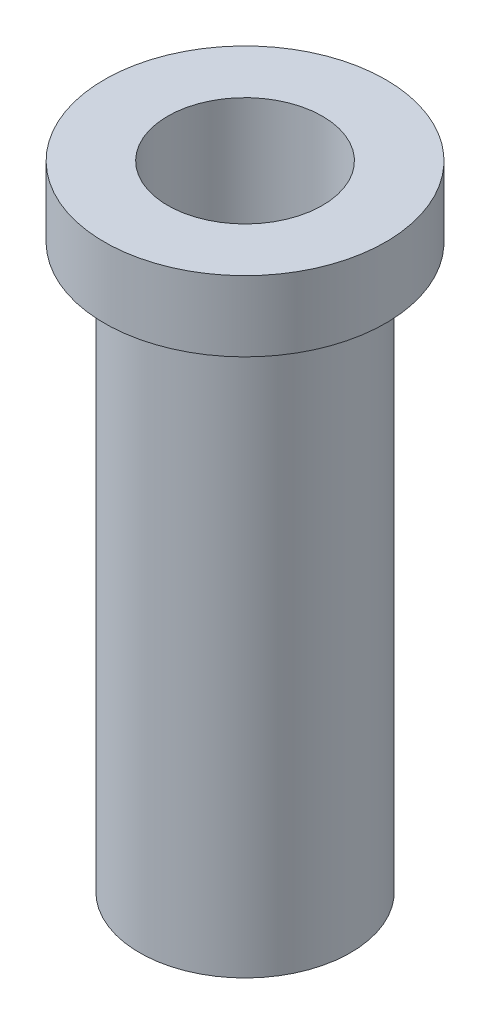
ISO-10303-21;
HEADER;
FILE_DESCRIPTION(('STEP AP214'),'2;1');
FILE_NAME('part.step','',(''),(''),'','','');
FILE_SCHEMA(('AUTOMOTIVE_DESIGN { 1 0 10303 214 1 1 1 1 }'));
ENDSEC;
DATA;
#1=APPLICATION_CONTEXT('core data for automotive mechanical design processes');
#2=APPLICATION_PROTOCOL_DEFINITION('international standard','automotive_design',2000,#1);
#3=PRODUCT_CONTEXT('',#1,'mechanical');
#4=PRODUCT('Part','Part','',(#3));
#5=PRODUCT_RELATED_PRODUCT_CATEGORY('part','',(#4));
#6=PRODUCT_DEFINITION_FORMATION('','',#4);
#7=PRODUCT_DEFINITION_CONTEXT('part definition',#1,'design');
#8=PRODUCT_DEFINITION('design','',#6,#7);
#9=PRODUCT_DEFINITION_SHAPE('','',#8);
#10=(LENGTH_UNIT() NAMED_UNIT(*) SI_UNIT(.MILLI.,.METRE.));
#11=(NAMED_UNIT(*) PLANE_ANGLE_UNIT() SI_UNIT($,.RADIAN.));
#12=(NAMED_UNIT(*) SI_UNIT($,.STERADIAN.) SOLID_ANGLE_UNIT());
#13=UNCERTAINTY_MEASURE_WITH_UNIT(LENGTH_MEASURE(1.E-05),#10,'distance_accuracy_value','');
#14=(GEOMETRIC_REPRESENTATION_CONTEXT(3) GLOBAL_UNCERTAINTY_ASSIGNED_CONTEXT((#13)) GLOBAL_UNIT_ASSIGNED_CONTEXT((#10,
#11,#12)) REPRESENTATION_CONTEXT('',''));
#15=CARTESIAN_POINT('',(0.,0.,0.));
#16=DIRECTION('',(0.,0.,1.));
#17=DIRECTION('',(1.,0.,0.));
#18=AXIS2_PLACEMENT_3D('',#15,#16,#17);
#19=CARTESIAN_POINT('',(7.5,0.,0.));
#20=DIRECTION('',(0.,-1.,0.));
#21=DIRECTION('',(0.,0.,-1.));
#22=AXIS2_PLACEMENT_3D('',#19,#20,#21);
#23=PLANE('',#22);
#24=CARTESIAN_POINT('',(0.,0.,0.));
#25=DIRECTION('',(0.,-1.,0.));
#26=DIRECTION('',(0.,0.,-1.));
#27=AXIS2_PLACEMENT_3D('',#24,#25,#26);
#28=CIRCLE('',#27,7.5);
#29=CARTESIAN_POINT('',(0.,0.,-7.5));
#30=VERTEX_POINT('',#29);
#31=EDGE_CURVE('E70',#30,#30,#28,.T.);
#32=ORIENTED_EDGE('',*,*,#31,.T.);
#33=EDGE_LOOP('',(#32));
#34=FACE_BOUND('',#33,.T.);
#35=CARTESIAN_POINT('',(0.,0.,0.));
#36=DIRECTION('',(0.,-1.,0.));
#37=DIRECTION('',(0.,0.,-1.));
#38=AXIS2_PLACEMENT_3D('',#35,#36,#37);
#39=CIRCLE('',#38,5.5);
#40=CARTESIAN_POINT('',(0.,0.,-5.5));
#41=VERTEX_POINT('',#40);
#42=EDGE_CURVE('E10',#41,#41,#39,.T.);
#43=ORIENTED_EDGE('',*,*,#42,.F.);
#44=EDGE_LOOP('',(#43));
#45=FACE_BOUND('',#44,.T.);
#46=ADVANCED_FACE('F43',(#34,#45),#23,.T.);
#47=CARTESIAN_POINT('',(0.,0.,0.));
#48=DIRECTION('',(0.,-1.,0.));
#49=DIRECTION('',(0.,0.,-1.));
#50=AXIS2_PLACEMENT_3D('',#47,#48,#49);
#51=CYLINDRICAL_SURFACE('',#50,5.5);
#52=ORIENTED_EDGE('',*,*,#42,.T.);
#53=EDGE_LOOP('',(#52));
#54=FACE_BOUND('',#53,.T.);
#55=CARTESIAN_POINT('',(0.,45.,0.));
#56=DIRECTION('',(0.,-1.,0.));
#57=DIRECTION('',(0.,0.,-1.));
#58=AXIS2_PLACEMENT_3D('',#55,#56,#57);
#59=CIRCLE('',#58,5.5);
#60=CARTESIAN_POINT('',(0.,45.,-5.5));
#61=VERTEX_POINT('',#60);
#62=EDGE_CURVE('E50',#61,#61,#59,.T.);
#63=ORIENTED_EDGE('',*,*,#62,.F.);
#64=EDGE_LOOP('',(#63));
#65=FACE_BOUND('',#64,.T.);
#66=ADVANCED_FACE('F89',(#54,#65),#51,.F.);
#67=CARTESIAN_POINT('',(5.5,45.,0.));
#68=DIRECTION('',(0.,1.,0.));
#69=DIRECTION('',(0.,0.,1.));
#70=AXIS2_PLACEMENT_3D('',#67,#68,#69);
#71=PLANE('',#70);
#72=ORIENTED_EDGE('',*,*,#62,.T.);
#73=EDGE_LOOP('',(#72));
#74=FACE_BOUND('',#73,.T.);
#75=CARTESIAN_POINT('',(0.,45.,0.));
#76=DIRECTION('',(0.,-1.,0.));
#77=DIRECTION('',(0.,0.,-1.));
#78=AXIS2_PLACEMENT_3D('',#75,#76,#77);
#79=CIRCLE('',#78,9.99999999999999);
#80=CARTESIAN_POINT('',(0.,45.,-9.99999999999999));
#81=VERTEX_POINT('',#80);
#82=EDGE_CURVE('E55',#81,#81,#79,.T.);
#83=ORIENTED_EDGE('',*,*,#82,.F.);
#84=EDGE_LOOP('',(#83));
#85=FACE_BOUND('',#84,.T.);
#86=ADVANCED_FACE('F93',(#74,#85),#71,.T.);
#87=CARTESIAN_POINT('',(0.,0.,0.));
#88=DIRECTION('',(0.,-1.,0.));
#89=DIRECTION('',(0.,0.,-1.));
#90=AXIS2_PLACEMENT_3D('',#87,#88,#89);
#91=CYLINDRICAL_SURFACE('',#90,9.99999999999999);
#92=ORIENTED_EDGE('',*,*,#82,.T.);
#93=EDGE_LOOP('',(#92));
#94=FACE_BOUND('',#93,.T.);
#95=CARTESIAN_POINT('',(0.,40.,0.));
#96=DIRECTION('',(0.,-1.,0.));
#97=DIRECTION('',(0.,0.,-1.));
#98=AXIS2_PLACEMENT_3D('',#95,#96,#97);
#99=CIRCLE('',#98,9.99999999999999);
#100=CARTESIAN_POINT('',(0.,40.,-9.99999999999999));
#101=VERTEX_POINT('',#100);
#102=EDGE_CURVE('E60',#101,#101,#99,.T.);
#103=ORIENTED_EDGE('',*,*,#102,.F.);
#104=EDGE_LOOP('',(#103));
#105=FACE_BOUND('',#104,.T.);
#106=ADVANCED_FACE('F85',(#94,#105),#91,.T.);
#107=CARTESIAN_POINT('',(9.99999999999999,40.,0.));
#108=DIRECTION('',(0.,-1.,0.));
#109=DIRECTION('',(0.,0.,-1.));
#110=AXIS2_PLACEMENT_3D('',#107,#108,#109);
#111=PLANE('',#110);
#112=ORIENTED_EDGE('',*,*,#102,.T.);
#113=EDGE_LOOP('',(#112));
#114=FACE_BOUND('',#113,.T.);
#115=CARTESIAN_POINT('',(0.,40.,0.));
#116=DIRECTION('',(0.,-1.,0.));
#117=DIRECTION('',(0.,0.,-1.));
#118=AXIS2_PLACEMENT_3D('',#115,#116,#117);
#119=CIRCLE('',#118,7.5);
#120=CARTESIAN_POINT('',(0.,40.,-7.5));
#121=VERTEX_POINT('',#120);
#122=EDGE_CURVE('E66',#121,#121,#119,.T.);
#123=ORIENTED_EDGE('',*,*,#122,.F.);
#124=EDGE_LOOP('',(#123));
#125=FACE_BOUND('',#124,.T.);
#126=ADVANCED_FACE('F79',(#114,#125),#111,.T.);
#127=CARTESIAN_POINT('',(0.,0.,0.));
#128=DIRECTION('',(0.,-1.,0.));
#129=DIRECTION('',(0.,0.,-1.));
#130=AXIS2_PLACEMENT_3D('',#127,#128,#129);
#131=CYLINDRICAL_SURFACE('',#130,7.5);
#132=ORIENTED_EDGE('',*,*,#122,.T.);
#133=EDGE_LOOP('',(#132));
#134=FACE_BOUND('',#133,.T.);
#135=ORIENTED_EDGE('',*,*,#31,.F.);
#136=EDGE_LOOP('',(#135));
#137=FACE_BOUND('',#136,.T.);
#138=ADVANCED_FACE('F77',(#134,#137),#131,.T.);
#139=CLOSED_SHELL('',(#46,#66,#86,#106,#126,#138));
#140=MANIFOLD_SOLID_BREP('B2',#139);
#141=ADVANCED_BREP_SHAPE_REPRESENTATION('',(#18,#140),#14);
#142=SHAPE_DEFINITION_REPRESENTATION(#9,#141);
ENDSEC;
END-ISO-10303-21;
